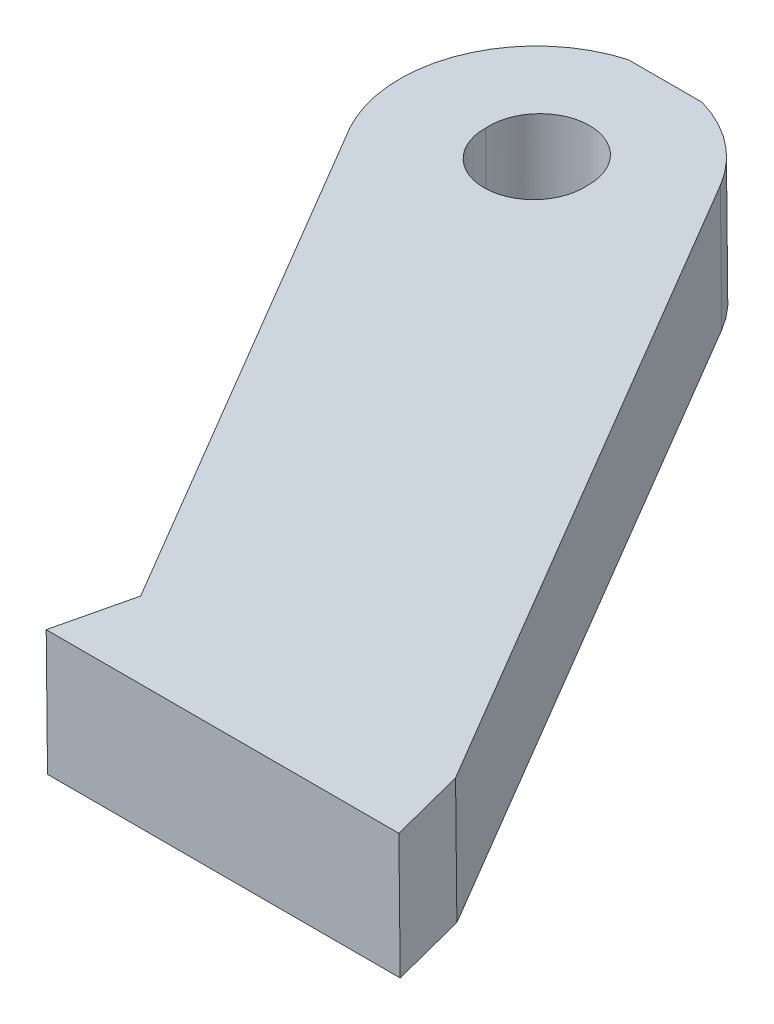
ISO-10303-21;
HEADER;
FILE_DESCRIPTION(('STEP AP214'),'2;1');
FILE_NAME('part.step','',(''),(''),'','','');
FILE_SCHEMA(('AUTOMOTIVE_DESIGN { 1 0 10303 214 1 1 1 1 }'));
ENDSEC;
DATA;
#1=APPLICATION_CONTEXT('core data for automotive mechanical design processes');
#2=APPLICATION_PROTOCOL_DEFINITION('international standard','automotive_design',2000,#1);
#3=PRODUCT_CONTEXT('',#1,'mechanical');
#4=PRODUCT('Part','Part','',(#3));
#5=PRODUCT_RELATED_PRODUCT_CATEGORY('part','',(#4));
#6=PRODUCT_DEFINITION_FORMATION('','',#4);
#7=PRODUCT_DEFINITION_CONTEXT('part definition',#1,'design');
#8=PRODUCT_DEFINITION('design','',#6,#7);
#9=PRODUCT_DEFINITION_SHAPE('','',#8);
#10=(LENGTH_UNIT() NAMED_UNIT(*) SI_UNIT(.MILLI.,.METRE.));
#11=(NAMED_UNIT(*) PLANE_ANGLE_UNIT() SI_UNIT($,.RADIAN.));
#12=(NAMED_UNIT(*) SI_UNIT($,.STERADIAN.) SOLID_ANGLE_UNIT());
#13=UNCERTAINTY_MEASURE_WITH_UNIT(LENGTH_MEASURE(1.E-05),#10,'distance_accuracy_value','');
#14=(GEOMETRIC_REPRESENTATION_CONTEXT(3) GLOBAL_UNCERTAINTY_ASSIGNED_CONTEXT((#13)) GLOBAL_UNIT_ASSIGNED_CONTEXT((#10,
#11,#12)) REPRESENTATION_CONTEXT('',''));
#15=CARTESIAN_POINT('',(0.,0.,0.));
#16=DIRECTION('',(0.,0.,1.));
#17=DIRECTION('',(1.,0.,0.));
#18=AXIS2_PLACEMENT_3D('',#15,#16,#17);
#19=CARTESIAN_POINT('',(90.,-4.24699463668975,60.9276494007652));
#20=DIRECTION('',(0.,0.999944602941541,0.0105257326625423));
#21=DIRECTION('',(0.,-0.0105257326625423,0.999944602941541));
#22=AXIS2_PLACEMENT_3D('',#19,#20,#21);
#23=CYLINDRICAL_SURFACE('',#22,2.);
#24=CARTESIAN_POINT('',(90.,0.752728378017961,60.9802780640779));
#25=DIRECTION('',(0.,-0.999944602941541,-0.0105257326625423));
#26=DIRECTION('',(0.,0.0105257326625423,-0.999944602941541));
#27=AXIS2_PLACEMENT_3D('',#24,#25,#26);
#28=CIRCLE('',#27,2.);
#29=CARTESIAN_POINT('',(91.9988875076363,0.752026324130787,61.0469731833594));
#30=VERTEX_POINT('',#29);
#31=CARTESIAN_POINT('',(88.0038952880956,0.751415148738527,61.105034845624));
#32=VERTEX_POINT('',#31);
#33=EDGE_CURVE('E148',#30,#32,#28,.F.);
#34=ORIENTED_EDGE('',*,*,#33,.T.);
#35=DIRECTION('',(0.,0.999944602941541,0.0105257326625423));
#36=VECTOR('',#35,1.);
#37=CARTESIAN_POINT('',(88.0038952880956,-4.24830786596918,61.0524061823113));
#38=LINE('',#37,#36);
#39=CARTESIAN_POINT('',(88.0038952880956,-4.24830786596918,61.0524061823113));
#40=VERTEX_POINT('',#39);
#41=EDGE_CURVE('E11',#40,#32,#38,.T.);
#42=ORIENTED_EDGE('',*,*,#41,.F.);
#43=CARTESIAN_POINT('',(90.,-4.24699463668975,60.9276494007652));
#44=DIRECTION('',(0.,-0.999944602941541,-0.0105257326625423));
#45=DIRECTION('',(0.,0.0105257326625423,-0.999944602941541));
#46=AXIS2_PLACEMENT_3D('',#43,#44,#45);
#47=CIRCLE('',#46,2.);
#48=CARTESIAN_POINT('',(91.9988875076363,-4.24769669057692,60.9943445200467));
#49=VERTEX_POINT('',#48);
#50=EDGE_CURVE('E130',#49,#40,#47,.F.);
#51=ORIENTED_EDGE('',*,*,#50,.F.);
#52=DIRECTION('',(0.,0.999944602941541,0.0105257326625423));
#53=VECTOR('',#52,1.);
#54=CARTESIAN_POINT('',(91.9988875076363,-4.24769669057692,60.9943445200467));
#55=LINE('',#54,#53);
#56=EDGE_CURVE('E45',#49,#30,#55,.T.);
#57=ORIENTED_EDGE('',*,*,#56,.T.);
#58=EDGE_LOOP('',(#34,#42,#51,#57));
#59=FACE_BOUND('',#58,.T.);
#60=ADVANCED_FACE('F35',(#59),#23,.F.);
#61=CARTESIAN_POINT('',(111.010643043755,-3.89738475610599,27.7147107453083));
#62=DIRECTION('',(0.970139338542731,-0.00255299825932288,0.242534834635688));
#63=DIRECTION('',(0.242535625036338,0.,-0.970142500145331));
#64=AXIS2_PLACEMENT_3D('',#61,#62,#63);
#65=PLANE('',#64);
#66=DIRECTION('',(0.242548271096441,0.0102114273229165,-0.970085595677081));
#67=VECTOR('',#66,1.);
#68=CARTESIAN_POINT('',(111.010643043755,1.10233825860171,27.7673394086211));
#69=LINE('',#68,#67);
#70=CARTESIAN_POINT('',(96.2522155097185,0.480999629869887,86.7945091381455));
#71=VERTEX_POINT('',#70);
#72=CARTESIAN_POINT('',(97.0022570598141,0.512576827857514,83.7946753293209));
#73=VERTEX_POINT('',#72);
#74=EDGE_CURVE('E161',#71,#73,#69,.T.);
#75=ORIENTED_EDGE('',*,*,#74,.T.);
#76=DIRECTION('',(0.,0.999944602941541,0.0105257326625423));
#77=VECTOR('',#76,1.);
#78=CARTESIAN_POINT('',(97.0022570598141,-4.48714618685019,83.7420466660081));
#79=LINE('',#78,#77);
#80=CARTESIAN_POINT('',(97.0022570598141,-4.48714618685019,83.7420466660081));
#81=VERTEX_POINT('',#80);
#82=EDGE_CURVE('E39',#81,#73,#79,.T.);
#83=ORIENTED_EDGE('',*,*,#82,.F.);
#84=DIRECTION('',(0.242548271096441,0.0102114273229165,-0.970085595677081));
#85=VECTOR('',#84,1.);
#86=CARTESIAN_POINT('',(111.010643043755,-3.89738475610599,27.7147107453083));
#87=LINE('',#86,#85);
#88=CARTESIAN_POINT('',(96.2522155097185,-4.51872338483782,86.7418804748328));
#89=VERTEX_POINT('',#88);
#90=EDGE_CURVE('E122',#89,#81,#87,.T.);
#91=ORIENTED_EDGE('',*,*,#90,.F.);
#92=DIRECTION('',(0.,0.999944602941541,0.0105257326625423));
#93=VECTOR('',#92,1.);
#94=CARTESIAN_POINT('',(96.2522155097185,-4.51872338483782,86.7418804748328));
#95=LINE('',#94,#93);
#96=EDGE_CURVE('E133',#89,#71,#95,.T.);
#97=ORIENTED_EDGE('',*,*,#96,.T.);
#98=EDGE_LOOP('',(#75,#83,#91,#97));
#99=FACE_BOUND('',#98,.T.);
#100=ADVANCED_FACE('F37',(#99),#65,.F.);
#101=CARTESIAN_POINT('',(35.7028807289389,-3.38520874418625,-20.9420103870687));
#102=DIRECTION('',(0.862951539781478,0.00531851262623026,-0.505258699491876));
#103=DIRECTION('',(-0.505265845662923,0.,-0.862963745012808));
#104=AXIS2_PLACEMENT_3D('',#101,#102,#103);
#105=PLANE('',#104);
#106=DIRECTION('',(-0.505286690888229,0.00908319720846905,-0.862903734804581));
#107=VECTOR('',#106,1.);
#108=CARTESIAN_POINT('',(35.7028807289389,1.61451427052145,-20.889381723756));
#109=LINE('',#108,#107);
#110=CARTESIAN_POINT('',(85.2712281456319,0.723457603083277,63.7610016828729));
#111=VERTEX_POINT('',#110);
#112=EDGE_CURVE('E163',#73,#111,#109,.T.);
#113=ORIENTED_EDGE('',*,*,#112,.T.);
#114=DIRECTION('',(0.,0.999944602941541,0.0105257326625423));
#115=VECTOR('',#114,1.);
#116=CARTESIAN_POINT('',(85.2712281456319,-4.27626541162443,63.7083730195602));
#117=LINE('',#116,#115);
#118=CARTESIAN_POINT('',(85.2712281456319,-4.27626541162443,63.7083730195602));
#119=VERTEX_POINT('',#118);
#120=EDGE_CURVE('E188',#119,#111,#117,.T.);
#121=ORIENTED_EDGE('',*,*,#120,.F.);
#122=DIRECTION('',(-0.505286690888229,0.00908319720846905,-0.862903734804581));
#123=VECTOR('',#122,1.);
#124=CARTESIAN_POINT('',(35.7028807289389,-3.38520874418625,-20.9420103870687));
#125=LINE('',#124,#123);
#126=EDGE_CURVE('E96',#81,#119,#125,.T.);
#127=ORIENTED_EDGE('',*,*,#126,.F.);
#128=ORIENTED_EDGE('',*,*,#82,.T.);
#129=EDGE_LOOP('',(#113,#121,#127,#128));
#130=FACE_BOUND('',#129,.T.);
#131=ADVANCED_FACE('F193',(#130),#105,.F.);
#132=CARTESIAN_POINT('',(90.0027827957318,-4.24900991985635,61.1191013015927));
#133=DIRECTION('',(0.,0.999944602941541,0.0105257326625423));
#134=DIRECTION('',(0.,-0.0105257326625423,0.999944602941541));
#135=AXIS2_PLACEMENT_3D('',#132,#133,#134);
#136=CYLINDRICAL_SURFACE('',#135,5.39376309251526);
#137=CARTESIAN_POINT('',(90.0027827957318,0.750713094851355,61.1717299649055));
#138=DIRECTION('',(0.,-0.999944602941541,-0.0105257326625423));
#139=DIRECTION('',(0.,0.0105257326625423,-0.999944602941541));
#140=AXIS2_PLACEMENT_3D('',#137,#138,#139);
#141=CIRCLE('',#140,5.39376309251526);
#142=CARTESIAN_POINT('',(88.539431391041,0.805357041330672,55.9805550493702));
#143=VERTEX_POINT('',#142);
#144=EDGE_CURVE('E165',#111,#143,#141,.T.);
#145=ORIENTED_EDGE('',*,*,#144,.T.);
#146=DIRECTION('',(0.,0.999944602941541,0.0105257326625423));
#147=VECTOR('',#146,1.);
#148=CARTESIAN_POINT('',(88.539431391041,-4.19436597337703,55.9279263860575));
#149=LINE('',#148,#147);
#150=CARTESIAN_POINT('',(88.539431391041,-4.19436597337703,55.9279263860575));
#151=VERTEX_POINT('',#150);
#152=EDGE_CURVE('E186',#151,#143,#149,.T.);
#153=ORIENTED_EDGE('',*,*,#152,.F.);
#154=CARTESIAN_POINT('',(90.0027827957318,-4.24900991985635,61.1191013015927));
#155=DIRECTION('',(0.,-0.999944602941541,-0.0105257326625423));
#156=DIRECTION('',(0.,0.0105257326625423,-0.999944602941541));
#157=AXIS2_PLACEMENT_3D('',#154,#155,#156);
#158=CIRCLE('',#157,5.39376309251526);
#159=EDGE_CURVE('E145',#119,#151,#158,.T.);
#160=ORIENTED_EDGE('',*,*,#159,.F.);
#161=ORIENTED_EDGE('',*,*,#120,.T.);
#162=EDGE_LOOP('',(#145,#153,#160,#161));
#163=FACE_BOUND('',#162,.T.);
#164=ADVANCED_FACE('F201',(#163),#136,.T.);
#165=CARTESIAN_POINT('',(0.,-4.19436597337704,55.9279263860575));
#166=DIRECTION('',(0.,-0.0105257326625423,0.999944602941541));
#167=DIRECTION('',(0.,-0.999944602941541,-0.0105257326625423));
#168=AXIS2_PLACEMENT_3D('',#165,#166,#167);
#169=PLANE('',#168);
#170=DIRECTION('',(1.,0.,0.));
#171=VECTOR('',#170,1.);
#172=CARTESIAN_POINT('',(0.,0.805357041330662,55.9805550493702));
#173=LINE('',#172,#171);
#174=CARTESIAN_POINT('',(91.4661342004227,0.805357041330672,55.9805550493702));
#175=VERTEX_POINT('',#174);
#176=EDGE_CURVE('E167',#143,#175,#173,.T.);
#177=ORIENTED_EDGE('',*,*,#176,.T.);
#178=DIRECTION('',(0.,0.999944602941541,0.0105257326625423));
#179=VECTOR('',#178,1.);
#180=CARTESIAN_POINT('',(91.4661342004227,-4.19436597337703,55.9279263860575));
#181=LINE('',#180,#179);
#182=CARTESIAN_POINT('',(91.4661342004227,-4.19436597337703,55.9279263860575));
#183=VERTEX_POINT('',#182);
#184=EDGE_CURVE('E183',#183,#175,#181,.T.);
#185=ORIENTED_EDGE('',*,*,#184,.F.);
#186=DIRECTION('',(1.,0.,0.));
#187=VECTOR('',#186,1.);
#188=CARTESIAN_POINT('',(0.,-4.19436597337704,55.9279263860575));
#189=LINE('',#188,#187);
#190=EDGE_CURVE('E152',#151,#183,#189,.T.);
#191=ORIENTED_EDGE('',*,*,#190,.F.);
#192=ORIENTED_EDGE('',*,*,#152,.T.);
#193=EDGE_LOOP('',(#177,#185,#191,#192));
#194=FACE_BOUND('',#193,.T.);
#195=ADVANCED_FACE('F204',(#194),#169,.F.);
#196=CARTESIAN_POINT('',(94.6573389616344,0.779399891961792,58.4464842394139));
#197=VERTEX_POINT('',#196);
#198=EDGE_CURVE('E168',#175,#197,#141,.T.);
#199=ORIENTED_EDGE('',*,*,#198,.T.);
#200=DIRECTION('',(0.,0.999944602941541,0.0105257326625423));
#201=VECTOR('',#200,1.);
#202=CARTESIAN_POINT('',(94.6573389616344,-4.22032312274591,58.3938555761012));
#203=LINE('',#202,#201);
#204=CARTESIAN_POINT('',(94.6573389616344,-4.22032312274591,58.3938555761012));
#205=VERTEX_POINT('',#204);
#206=EDGE_CURVE('E181',#205,#197,#203,.T.);
#207=ORIENTED_EDGE('',*,*,#206,.F.);
#208=EDGE_CURVE('E153',#183,#205,#158,.T.);
#209=ORIENTED_EDGE('',*,*,#208,.F.);
#210=ORIENTED_EDGE('',*,*,#184,.T.);
#211=EDGE_LOOP('',(#199,#207,#209,#210));
#212=FACE_BOUND('',#211,.T.);
#213=ADVANCED_FACE('F210',(#212),#136,.T.);
#214=CARTESIAN_POINT('',(45.0186049375596,-3.32784343488141,-26.3917147710287));
#215=DIRECTION('',(0.862990476874823,0.0053178126185717,-0.505192198764312));
#216=DIRECTION('',(-0.505199342114014,0.,-0.863002679444025));
#217=AXIS2_PLACEMENT_3D('',#214,#215,#216);
#218=PLANE('',#217);
#219=DIRECTION('',(-0.505220186476517,0.00908360704990425,-0.862942669740926));
#220=VECTOR('',#219,1.);
#221=CARTESIAN_POINT('',(45.0186049375596,1.6718795798263,-26.339086107716));
#222=LINE('',#221,#220);
#223=CARTESIAN_POINT('',(109.497742940186,0.512576827857516,83.7946753293208));
#224=VERTEX_POINT('',#223);
#225=EDGE_CURVE('E170',#224,#197,#222,.T.);
#226=ORIENTED_EDGE('',*,*,#225,.F.);
#227=DIRECTION('',(0.,0.999944602941541,0.0105257326625423));
#228=VECTOR('',#227,1.);
#229=CARTESIAN_POINT('',(109.497742940186,-4.48714618685019,83.7420466660081));
#230=LINE('',#229,#228);
#231=CARTESIAN_POINT('',(109.497742940186,-4.48714618685019,83.7420466660081));
#232=VERTEX_POINT('',#231);
#233=EDGE_CURVE('E179',#232,#224,#230,.T.);
#234=ORIENTED_EDGE('',*,*,#233,.F.);
#235=DIRECTION('',(-0.505220186476517,0.00908360704990425,-0.862942669740926));
#236=VECTOR('',#235,1.);
#237=CARTESIAN_POINT('',(45.0186049375596,-3.32784343488141,-26.3917147710287));
#238=LINE('',#237,#236);
#239=EDGE_CURVE('E155',#232,#205,#238,.T.);
#240=ORIENTED_EDGE('',*,*,#239,.T.);
#241=ORIENTED_EDGE('',*,*,#206,.T.);
#242=EDGE_LOOP('',(#226,#234,#240,#241));
#243=FACE_BOUND('',#242,.T.);
#244=ADVANCED_FACE('F213',(#243),#218,.T.);
#245=CARTESIAN_POINT('',(83.3410313790949,-3.38593298130903,-20.8732078604044));
#246=DIRECTION('',(-0.970139338542733,-0.002552998259323,0.24253483463568));
#247=DIRECTION('',(0.24253562503633,0.,0.970142500145333));
#248=AXIS2_PLACEMENT_3D('',#245,#246,#247);
#249=PLANE('',#248);
#250=DIRECTION('',(0.242548271096433,-0.0102114273229164,0.970085595677083));
#251=VECTOR('',#250,1.);
#252=CARTESIAN_POINT('',(83.3410313790949,1.61379003339868,-20.8205791970917));
#253=LINE('',#252,#251);
#254=CARTESIAN_POINT('',(110.247784490282,0.480999629869889,86.7945091381455));
#255=VERTEX_POINT('',#254);
#256=EDGE_CURVE('E173',#224,#255,#253,.T.);
#257=ORIENTED_EDGE('',*,*,#256,.T.);
#258=DIRECTION('',(0.,0.999944602941541,0.0105257326625423));
#259=VECTOR('',#258,1.);
#260=CARTESIAN_POINT('',(110.247784490282,-4.51872338483782,86.7418804748328));
#261=LINE('',#260,#259);
#262=CARTESIAN_POINT('',(110.247784490282,-4.51872338483782,86.7418804748328));
#263=VERTEX_POINT('',#262);
#264=EDGE_CURVE('E140',#263,#255,#261,.T.);
#265=ORIENTED_EDGE('',*,*,#264,.F.);
#266=DIRECTION('',(0.242548271096433,-0.0102114273229164,0.970085595677083));
#267=VECTOR('',#266,1.);
#268=CARTESIAN_POINT('',(83.3410313790949,-3.38593298130903,-20.8732078604044));
#269=LINE('',#268,#267);
#270=EDGE_CURVE('E126',#232,#263,#269,.T.);
#271=ORIENTED_EDGE('',*,*,#270,.F.);
#272=ORIENTED_EDGE('',*,*,#233,.T.);
#273=EDGE_LOOP('',(#257,#265,#271,#272));
#274=FACE_BOUND('',#273,.T.);
#275=ADVANCED_FACE('F215',(#274),#249,.F.);
#276=CARTESIAN_POINT('',(0.,-4.51872338483783,86.7418804748328));
#277=DIRECTION('',(0.,0.0105257326625423,-0.999944602941541));
#278=DIRECTION('',(0.,0.999944602941541,0.0105257326625423));
#279=AXIS2_PLACEMENT_3D('',#276,#277,#278);
#280=PLANE('',#279);
#281=DIRECTION('',(-1.,0.,0.));
#282=VECTOR('',#281,1.);
#283=CARTESIAN_POINT('',(0.,0.480999629869877,86.7945091381455));
#284=LINE('',#283,#282);
#285=EDGE_CURVE('E136',#255,#71,#284,.T.);
#286=ORIENTED_EDGE('',*,*,#285,.T.);
#287=ORIENTED_EDGE('',*,*,#96,.F.);
#288=DIRECTION('',(-1.,0.,0.));
#289=VECTOR('',#288,1.);
#290=CARTESIAN_POINT('',(0.,-4.51872338483783,86.7418804748328));
#291=LINE('',#290,#289);
#292=EDGE_CURVE('E117',#263,#89,#291,.T.);
#293=ORIENTED_EDGE('',*,*,#292,.F.);
#294=ORIENTED_EDGE('',*,*,#264,.T.);
#295=EDGE_LOOP('',(#286,#287,#293,#294));
#296=FACE_BOUND('',#295,.T.);
#297=ADVANCED_FACE('F134',(#296),#280,.F.);
#298=CARTESIAN_POINT('',(90.0027827957318,-4.24900991985635,61.1191013015927));
#299=DIRECTION('',(0.,0.999944602941541,0.0105257326625423));
#300=DIRECTION('',(0.,-0.0105257326625423,0.999944602941541));
#301=AXIS2_PLACEMENT_3D('',#298,#299,#300);
#302=CYLINDRICAL_SURFACE('',#301,2.);
#303=CARTESIAN_POINT('',(90.0027827957318,0.750713094851355,61.1717299649055));
#304=DIRECTION('',(0.,-0.999944602941541,-0.0105257326625423));
#305=DIRECTION('',(0.,0.0105257326625423,-0.999944602941541));
#306=AXIS2_PLACEMENT_3D('',#303,#304,#305);
#307=CIRCLE('',#306,2.);
#308=EDGE_CURVE('E143',#30,#32,#307,.T.);
#309=ORIENTED_EDGE('',*,*,#308,.F.);
#310=ORIENTED_EDGE('',*,*,#56,.F.);
#311=CARTESIAN_POINT('',(90.0027827957318,-4.24900991985635,61.1191013015927));
#312=DIRECTION('',(0.,-0.999944602941541,-0.0105257326625423));
#313=DIRECTION('',(0.,0.0105257326625423,-0.999944602941541));
#314=AXIS2_PLACEMENT_3D('',#311,#312,#313);
#315=CIRCLE('',#314,2.);
#316=EDGE_CURVE('E141',#49,#40,#315,.T.);
#317=ORIENTED_EDGE('',*,*,#316,.T.);
#318=ORIENTED_EDGE('',*,*,#41,.T.);
#319=EDGE_LOOP('',(#309,#310,#317,#318));
#320=FACE_BOUND('',#319,.T.);
#321=ADVANCED_FACE('F222',(#320),#302,.F.);
#322=CARTESIAN_POINT('',(0.,-3.60525148493823,-0.037950015630928));
#323=DIRECTION('',(0.,-0.999944602941541,-0.0105257326625423));
#324=DIRECTION('',(0.,0.0105257326625423,-0.999944602941541));
#325=AXIS2_PLACEMENT_3D('',#322,#323,#324);
#326=PLANE('',#325);
#327=ORIENTED_EDGE('',*,*,#90,.T.);
#328=ORIENTED_EDGE('',*,*,#126,.T.);
#329=ORIENTED_EDGE('',*,*,#159,.T.);
#330=ORIENTED_EDGE('',*,*,#190,.T.);
#331=ORIENTED_EDGE('',*,*,#208,.T.);
#332=ORIENTED_EDGE('',*,*,#239,.F.);
#333=ORIENTED_EDGE('',*,*,#270,.T.);
#334=ORIENTED_EDGE('',*,*,#292,.T.);
#335=EDGE_LOOP('',(#327,#328,#329,#330,#331,#332,#333,#334));
#336=FACE_BOUND('',#335,.T.);
#337=ORIENTED_EDGE('',*,*,#50,.T.);
#338=ORIENTED_EDGE('',*,*,#316,.F.);
#339=EDGE_LOOP('',(#337,#338));
#340=FACE_BOUND('',#339,.T.);
#341=ADVANCED_FACE('F119',(#336,#340),#326,.T.);
#342=CARTESIAN_POINT('',(0.,1.39447152976948,0.0146786476817837));
#343=DIRECTION('',(0.,-0.999944602941541,-0.0105257326625423));
#344=DIRECTION('',(0.,0.0105257326625423,-0.999944602941541));
#345=AXIS2_PLACEMENT_3D('',#342,#343,#344);
#346=PLANE('',#345);
#347=ORIENTED_EDGE('',*,*,#74,.F.);
#348=ORIENTED_EDGE('',*,*,#285,.F.);
#349=ORIENTED_EDGE('',*,*,#256,.F.);
#350=ORIENTED_EDGE('',*,*,#225,.T.);
#351=ORIENTED_EDGE('',*,*,#198,.F.);
#352=ORIENTED_EDGE('',*,*,#176,.F.);
#353=ORIENTED_EDGE('',*,*,#144,.F.);
#354=ORIENTED_EDGE('',*,*,#112,.F.);
#355=EDGE_LOOP('',(#347,#348,#349,#350,#351,#352,#353,#354));
#356=FACE_BOUND('',#355,.T.);
#357=ORIENTED_EDGE('',*,*,#33,.F.);
#358=ORIENTED_EDGE('',*,*,#308,.T.);
#359=EDGE_LOOP('',(#357,#358));
#360=FACE_BOUND('',#359,.T.);
#361=ADVANCED_FACE('F195',(#356,#360),#346,.F.);
#362=CLOSED_SHELL('',(#60,#100,#131,#164,#195,#213,#244,#275,#297,#321,#341,#361));
#363=MANIFOLD_SOLID_BREP('B2',#362);
#364=ADVANCED_BREP_SHAPE_REPRESENTATION('',(#18,#363),#14);
#365=SHAPE_DEFINITION_REPRESENTATION(#9,#364);
ENDSEC;
END-ISO-10303-21;
